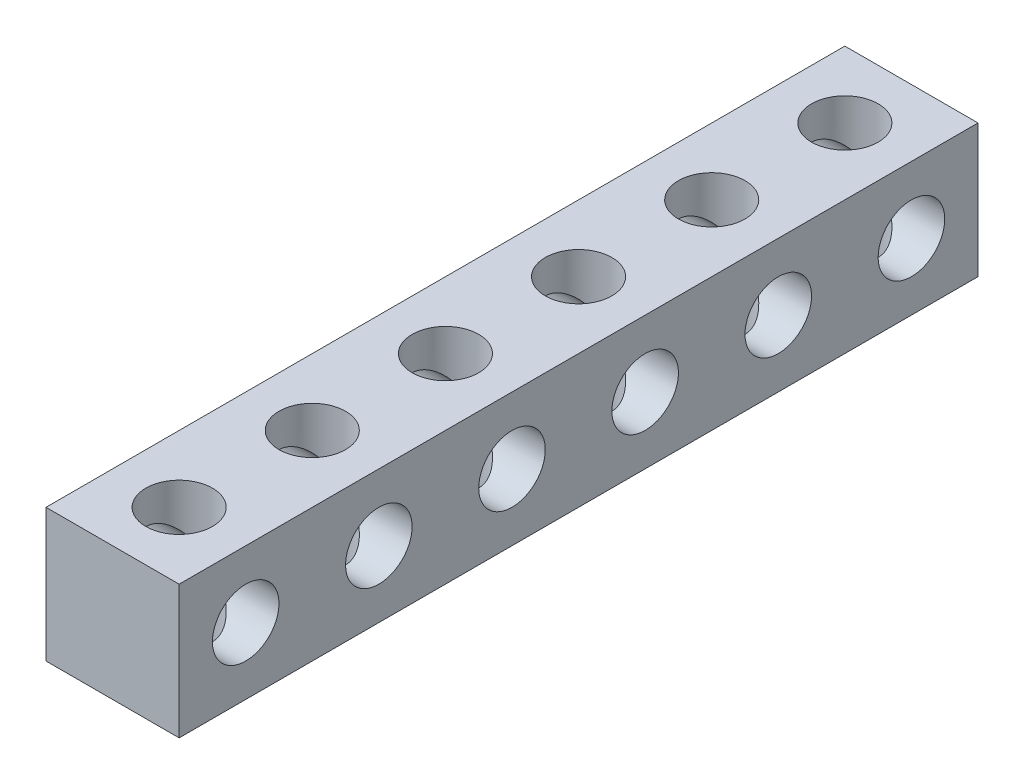
ISO-10303-21;
HEADER;
FILE_DESCRIPTION(('STEP AP214'),'2;1');
FILE_NAME('part.step','',(''),(''),'','','');
FILE_SCHEMA(('AUTOMOTIVE_DESIGN { 1 0 10303 214 1 1 1 1 }'));
ENDSEC;
DATA;
#1=APPLICATION_CONTEXT('core data for automotive mechanical design processes');
#2=APPLICATION_PROTOCOL_DEFINITION('international standard','automotive_design',2000,#1);
#3=PRODUCT_CONTEXT('',#1,'mechanical');
#4=PRODUCT('Part','Part','',(#3));
#5=PRODUCT_RELATED_PRODUCT_CATEGORY('part','',(#4));
#6=PRODUCT_DEFINITION_FORMATION('','',#4);
#7=PRODUCT_DEFINITION_CONTEXT('part definition',#1,'design');
#8=PRODUCT_DEFINITION('design','',#6,#7);
#9=PRODUCT_DEFINITION_SHAPE('','',#8);
#10=(LENGTH_UNIT() NAMED_UNIT(*) SI_UNIT(.MILLI.,.METRE.));
#11=(NAMED_UNIT(*) PLANE_ANGLE_UNIT() SI_UNIT($,.RADIAN.));
#12=(NAMED_UNIT(*) SI_UNIT($,.STERADIAN.) SOLID_ANGLE_UNIT());
#13=UNCERTAINTY_MEASURE_WITH_UNIT(LENGTH_MEASURE(1.E-05),#10,'distance_accuracy_value','');
#14=(GEOMETRIC_REPRESENTATION_CONTEXT(3) GLOBAL_UNCERTAINTY_ASSIGNED_CONTEXT((#13)) GLOBAL_UNIT_ASSIGNED_CONTEXT((#10,
#11,#12)) REPRESENTATION_CONTEXT('',''));
#15=CARTESIAN_POINT('',(0.,0.,0.));
#16=DIRECTION('',(0.,0.,1.));
#17=DIRECTION('',(1.,0.,0.));
#18=AXIS2_PLACEMENT_3D('',#15,#16,#17);
#19=CARTESIAN_POINT('',(0.,-6.35,-31.75));
#20=DIRECTION('',(0.,1.,0.));
#21=DIRECTION('',(0.,0.,1.));
#22=AXIS2_PLACEMENT_3D('',#19,#20,#21);
#23=CYLINDRICAL_SURFACE('',#22,3.175);
#24=CARTESIAN_POINT('',(0.,6.35,-31.75));
#25=DIRECTION('',(0.,1.,0.));
#26=DIRECTION('',(0.,0.,1.));
#27=AXIS2_PLACEMENT_3D('',#24,#25,#26);
#28=CIRCLE('',#27,3.175);
#29=CARTESIAN_POINT('',(0.,6.35,-28.575));
#30=VERTEX_POINT('',#29);
#31=EDGE_CURVE('E244',#30,#30,#28,.T.);
#32=ORIENTED_EDGE('',*,*,#31,.T.);
#33=EDGE_LOOP('',(#32));
#34=FACE_BOUND('',#33,.T.);
#35=CARTESIAN_POINT('',(0.,-4.43319989072576E-13,-31.75));
#36=DIRECTION('',(0.707106781186547,0.707106781186547,0.));
#37=DIRECTION('',(-0.707106781186547,0.707106781186547,0.));
#38=AXIS2_PLACEMENT_3D('',#35,#36,#37);
#39=ELLIPSE('',#38,4.49012806053457,3.175);
#40=CARTESIAN_POINT('',(0.,-4.43319989072576E-13,-28.575));
#41=VERTEX_POINT('',#40);
#42=CARTESIAN_POINT('',(0.,-4.43319989072576E-13,-34.925));
#43=VERTEX_POINT('',#42);
#44=EDGE_CURVE('E46',#41,#43,#39,.F.);
#45=ORIENTED_EDGE('',*,*,#44,.T.);
#46=CARTESIAN_POINT('',(0.,-4.43319989072576E-13,-31.75));
#47=DIRECTION('',(-0.707106781186547,0.707106781186547,0.));
#48=DIRECTION('',(0.707106781186547,0.707106781186547,0.));
#49=AXIS2_PLACEMENT_3D('',#46,#47,#48);
#50=ELLIPSE('',#49,4.49012806053457,3.175);
#51=EDGE_CURVE('E11',#43,#41,#50,.F.);
#52=ORIENTED_EDGE('',*,*,#51,.T.);
#53=EDGE_LOOP('',(#45,#52));
#54=FACE_BOUND('',#53,.T.);
#55=ADVANCED_FACE('F33',(#34,#54),#23,.F.);
#56=CARTESIAN_POINT('',(5.32101756039693E-13,-6.35,19.05));
#57=DIRECTION('',(0.,1.,0.));
#58=DIRECTION('',(0.,0.,1.));
#59=AXIS2_PLACEMENT_3D('',#56,#57,#58);
#60=CYLINDRICAL_SURFACE('',#59,3.175);
#61=CARTESIAN_POINT('',(5.32101756039693E-13,6.35,19.05));
#62=DIRECTION('',(0.,1.,0.));
#63=DIRECTION('',(0.,0.,1.));
#64=AXIS2_PLACEMENT_3D('',#61,#62,#63);
#65=CIRCLE('',#64,3.175);
#66=CARTESIAN_POINT('',(5.32101756039693E-13,6.35,22.225));
#67=VERTEX_POINT('',#66);
#68=EDGE_CURVE('E237',#67,#67,#65,.T.);
#69=ORIENTED_EDGE('',*,*,#68,.T.);
#70=EDGE_LOOP('',(#69));
#71=FACE_BOUND('',#70,.T.);
#72=CARTESIAN_POINT('',(5.31897250713293E-13,0.,19.05));
#73=DIRECTION('',(0.707106781186547,0.707106781186547,0.));
#74=DIRECTION('',(-0.707106781186547,0.707106781186547,0.));
#75=AXIS2_PLACEMENT_3D('',#72,#73,#74);
#76=ELLIPSE('',#75,4.49012806053457,3.175);
#77=CARTESIAN_POINT('',(5.31897250713293E-13,0.,22.225));
#78=VERTEX_POINT('',#77);
#79=CARTESIAN_POINT('',(5.31897250713293E-13,0.,15.875));
#80=VERTEX_POINT('',#79);
#81=EDGE_CURVE('E53',#78,#80,#76,.F.);
#82=ORIENTED_EDGE('',*,*,#81,.T.);
#83=CARTESIAN_POINT('',(5.31897250713293E-13,0.,19.05));
#84=DIRECTION('',(-0.707106781186547,0.707106781186547,0.));
#85=DIRECTION('',(0.707106781186547,0.707106781186547,0.));
#86=AXIS2_PLACEMENT_3D('',#83,#84,#85);
#87=ELLIPSE('',#86,4.49012806053457,3.175);
#88=EDGE_CURVE('E162',#80,#78,#87,.F.);
#89=ORIENTED_EDGE('',*,*,#88,.T.);
#90=EDGE_LOOP('',(#82,#89));
#91=FACE_BOUND('',#90,.T.);
#92=ADVANCED_FACE('F177',(#71,#91),#60,.F.);
#93=CARTESIAN_POINT('',(3.9907631702977E-13,-6.35,6.34999999999999));
#94=DIRECTION('',(0.,1.,0.));
#95=DIRECTION('',(0.,0.,1.));
#96=AXIS2_PLACEMENT_3D('',#93,#94,#95);
#97=CYLINDRICAL_SURFACE('',#96,3.175);
#98=CARTESIAN_POINT('',(3.9907631702977E-13,6.35,6.34999999999999));
#99=DIRECTION('',(0.,1.,0.));
#100=DIRECTION('',(0.,0.,1.));
#101=AXIS2_PLACEMENT_3D('',#98,#99,#100);
#102=CIRCLE('',#101,3.175);
#103=CARTESIAN_POINT('',(3.9907631702977E-13,6.35,9.52499999999999));
#104=VERTEX_POINT('',#103);
#105=EDGE_CURVE('E233',#104,#104,#102,.T.);
#106=ORIENTED_EDGE('',*,*,#105,.T.);
#107=EDGE_LOOP('',(#106));
#108=FACE_BOUND('',#107,.T.);
#109=CARTESIAN_POINT('',(3.99031358252218E-13,-1.77154523281433E-13,6.35));
#110=DIRECTION('',(0.707106781186547,0.707106781186547,0.));
#111=DIRECTION('',(-0.707106781186547,0.707106781186547,0.));
#112=AXIS2_PLACEMENT_3D('',#109,#110,#111);
#113=ELLIPSE('',#112,4.49012806053457,3.175);
#114=CARTESIAN_POINT('',(3.99031358252218E-13,-1.77154523281433E-13,9.525));
#115=VERTEX_POINT('',#114);
#116=CARTESIAN_POINT('',(3.99031358252218E-13,-1.77154523281433E-13,3.175));
#117=VERTEX_POINT('',#116);
#118=EDGE_CURVE('E144',#115,#117,#113,.F.);
#119=ORIENTED_EDGE('',*,*,#118,.T.);
#120=CARTESIAN_POINT('',(3.99031358252218E-13,-1.77154523281433E-13,6.35));
#121=DIRECTION('',(-0.707106781186547,0.707106781186547,0.));
#122=DIRECTION('',(0.707106781186547,0.707106781186547,0.));
#123=AXIS2_PLACEMENT_3D('',#120,#121,#122);
#124=ELLIPSE('',#123,4.49012806053457,3.175);
#125=EDGE_CURVE('E152',#117,#115,#124,.F.);
#126=ORIENTED_EDGE('',*,*,#125,.T.);
#127=EDGE_LOOP('',(#119,#126));
#128=FACE_BOUND('',#127,.T.);
#129=ADVANCED_FACE('F183',(#108,#128),#97,.F.);
#130=CARTESIAN_POINT('',(2.66050878019847E-13,-6.35,-6.35));
#131=DIRECTION('',(0.,1.,0.));
#132=DIRECTION('',(0.,0.,1.));
#133=AXIS2_PLACEMENT_3D('',#130,#131,#132);
#134=CYLINDRICAL_SURFACE('',#133,3.175);
#135=CARTESIAN_POINT('',(2.66050878019847E-13,6.35,-6.35));
#136=DIRECTION('',(0.,1.,0.));
#137=DIRECTION('',(0.,0.,1.));
#138=AXIS2_PLACEMENT_3D('',#135,#136,#137);
#139=CIRCLE('',#138,3.175);
#140=CARTESIAN_POINT('',(2.66050878019847E-13,6.35,-3.175));
#141=VERTEX_POINT('',#140);
#142=EDGE_CURVE('E229',#141,#141,#139,.T.);
#143=ORIENTED_EDGE('',*,*,#142,.T.);
#144=EDGE_LOOP('',(#143));
#145=FACE_BOUND('',#144,.T.);
#146=CARTESIAN_POINT('',(2.66165465791143E-13,-2.66165465791143E-13,-6.35));
#147=DIRECTION('',(0.707106781186547,0.707106781186547,0.));
#148=DIRECTION('',(-0.707106781186547,0.707106781186547,0.));
#149=AXIS2_PLACEMENT_3D('',#146,#147,#148);
#150=ELLIPSE('',#149,4.49012806053457,3.175);
#151=CARTESIAN_POINT('',(2.66165465791143E-13,-2.66165465791143E-13,-3.175));
#152=VERTEX_POINT('',#151);
#153=CARTESIAN_POINT('',(2.66165465791143E-13,-2.66165465791143E-13,-9.525));
#154=VERTEX_POINT('',#153);
#155=EDGE_CURVE('E128',#152,#154,#150,.F.);
#156=ORIENTED_EDGE('',*,*,#155,.T.);
#157=CARTESIAN_POINT('',(2.66165465791143E-13,-2.66165465791143E-13,-6.35));
#158=DIRECTION('',(-0.707106781186547,0.707106781186547,0.));
#159=DIRECTION('',(0.707106781186547,0.707106781186547,0.));
#160=AXIS2_PLACEMENT_3D('',#157,#158,#159);
#161=ELLIPSE('',#160,4.49012806053457,3.175);
#162=EDGE_CURVE('E141',#154,#152,#161,.F.);
#163=ORIENTED_EDGE('',*,*,#162,.T.);
#164=EDGE_LOOP('',(#156,#163));
#165=FACE_BOUND('',#164,.T.);
#166=ADVANCED_FACE('F313',(#145,#165),#134,.F.);
#167=CARTESIAN_POINT('',(1.33025439009923E-13,-6.35,-19.05));
#168=DIRECTION('',(0.,1.,0.));
#169=DIRECTION('',(0.,0.,1.));
#170=AXIS2_PLACEMENT_3D('',#167,#168,#169);
#171=CYLINDRICAL_SURFACE('',#170,3.175);
#172=CARTESIAN_POINT('',(1.33025439009923E-13,6.35,-19.05));
#173=DIRECTION('',(0.,1.,0.));
#174=DIRECTION('',(0.,0.,1.));
#175=AXIS2_PLACEMENT_3D('',#172,#173,#174);
#176=CIRCLE('',#175,3.175);
#177=CARTESIAN_POINT('',(1.33025439009923E-13,6.35,-15.875));
#178=VERTEX_POINT('',#177);
#179=EDGE_CURVE('E225',#178,#178,#176,.T.);
#180=ORIENTED_EDGE('',*,*,#179,.T.);
#181=EDGE_LOOP('',(#180));
#182=FACE_BOUND('',#181,.T.);
#183=CARTESIAN_POINT('',(1.32865892461075E-13,-3.5474272743186E-13,-19.05));
#184=DIRECTION('',(0.707106781186547,0.707106781186547,0.));
#185=DIRECTION('',(-0.707106781186547,0.707106781186547,0.));
#186=AXIS2_PLACEMENT_3D('',#183,#184,#185);
#187=ELLIPSE('',#186,4.49012806053457,3.175);
#188=CARTESIAN_POINT('',(1.32865892461075E-13,-3.5474272743186E-13,-15.875));
#189=VERTEX_POINT('',#188);
#190=CARTESIAN_POINT('',(1.32865892461075E-13,-3.5474272743186E-13,-22.225));
#191=VERTEX_POINT('',#190);
#192=EDGE_CURVE('E119',#189,#191,#187,.F.);
#193=ORIENTED_EDGE('',*,*,#192,.T.);
#194=CARTESIAN_POINT('',(1.32865892461075E-13,-3.5474272743186E-13,-19.05));
#195=DIRECTION('',(-0.707106781186547,0.707106781186547,0.));
#196=DIRECTION('',(0.707106781186547,0.707106781186547,0.));
#197=AXIS2_PLACEMENT_3D('',#194,#195,#196);
#198=ELLIPSE('',#197,4.49012806053457,3.175);
#199=EDGE_CURVE('E115',#191,#189,#198,.F.);
#200=ORIENTED_EDGE('',*,*,#199,.T.);
#201=EDGE_LOOP('',(#193,#200));
#202=FACE_BOUND('',#201,.T.);
#203=ADVANCED_FACE('F127',(#182,#202),#171,.F.);
#204=CARTESIAN_POINT('',(6.65127195049617E-13,-6.35,31.75));
#205=DIRECTION('',(0.,1.,0.));
#206=DIRECTION('',(0.,0.,1.));
#207=AXIS2_PLACEMENT_3D('',#204,#205,#206);
#208=CYLINDRICAL_SURFACE('',#207,3.175);
#209=CARTESIAN_POINT('',(6.65127195049617E-13,6.35,31.75));
#210=DIRECTION('',(0.,1.,0.));
#211=DIRECTION('',(0.,0.,1.));
#212=AXIS2_PLACEMENT_3D('',#209,#210,#211);
#213=CIRCLE('',#212,3.175);
#214=CARTESIAN_POINT('',(6.65127195049617E-13,6.35,34.925));
#215=VERTEX_POINT('',#214);
#216=EDGE_CURVE('E241',#215,#215,#213,.T.);
#217=ORIENTED_EDGE('',*,*,#216,.T.);
#218=EDGE_LOOP('',(#217));
#219=FACE_BOUND('',#218,.T.);
#220=CARTESIAN_POINT('',(6.65196824043361E-13,0.,31.75));
#221=DIRECTION('',(0.707106781186547,0.707106781186547,0.));
#222=DIRECTION('',(-0.707106781186547,0.707106781186547,0.));
#223=AXIS2_PLACEMENT_3D('',#220,#221,#222);
#224=ELLIPSE('',#223,4.49012806053457,3.175);
#225=CARTESIAN_POINT('',(6.65196824043361E-13,0.,34.925));
#226=VERTEX_POINT('',#225);
#227=CARTESIAN_POINT('',(6.65196824043361E-13,0.,28.575));
#228=VERTEX_POINT('',#227);
#229=EDGE_CURVE('E277',#226,#228,#224,.F.);
#230=ORIENTED_EDGE('',*,*,#229,.T.);
#231=CARTESIAN_POINT('',(6.65196824043361E-13,0.,31.75));
#232=DIRECTION('',(-0.707106781186547,0.707106781186547,0.));
#233=DIRECTION('',(0.707106781186547,0.707106781186547,0.));
#234=AXIS2_PLACEMENT_3D('',#231,#232,#233);
#235=ELLIPSE('',#234,4.49012806053457,3.175);
#236=EDGE_CURVE('E125',#228,#226,#235,.F.);
#237=ORIENTED_EDGE('',*,*,#236,.T.);
#238=EDGE_LOOP('',(#230,#237));
#239=FACE_BOUND('',#238,.T.);
#240=ADVANCED_FACE('F198',(#219,#239),#208,.F.);
#241=CARTESIAN_POINT('',(6.35,-6.35,38.1));
#242=DIRECTION('',(-1.,0.,0.));
#243=DIRECTION('',(0.,0.,1.));
#244=AXIS2_PLACEMENT_3D('',#241,#242,#243);
#245=PLANE('',#244);
#246=CARTESIAN_POINT('',(6.35,0.,19.05));
#247=DIRECTION('',(-1.,0.,0.));
#248=DIRECTION('',(0.,0.,1.));
#249=AXIS2_PLACEMENT_3D('',#246,#247,#248);
#250=CIRCLE('',#249,3.175);
#251=CARTESIAN_POINT('',(6.35,0.,22.225));
#252=VERTEX_POINT('',#251);
#253=EDGE_CURVE('E425',#252,#252,#250,.T.);
#254=ORIENTED_EDGE('',*,*,#253,.T.);
#255=EDGE_LOOP('',(#254));
#256=FACE_BOUND('',#255,.T.);
#257=CARTESIAN_POINT('',(6.35,-1.77367252013231E-13,6.35));
#258=DIRECTION('',(-1.,0.,0.));
#259=DIRECTION('',(0.,0.,1.));
#260=AXIS2_PLACEMENT_3D('',#257,#258,#259);
#261=CIRCLE('',#260,3.175);
#262=CARTESIAN_POINT('',(6.35,-1.77367252013231E-13,9.525));
#263=VERTEX_POINT('',#262);
#264=EDGE_CURVE('E432',#263,#263,#261,.T.);
#265=ORIENTED_EDGE('',*,*,#264,.T.);
#266=EDGE_LOOP('',(#265));
#267=FACE_BOUND('',#266,.T.);
#268=CARTESIAN_POINT('',(6.35,-2.66050878019847E-13,-6.34999999999999));
#269=DIRECTION('',(-1.,0.,0.));
#270=DIRECTION('',(0.,0.,1.));
#271=AXIS2_PLACEMENT_3D('',#268,#269,#270);
#272=CIRCLE('',#271,3.175);
#273=CARTESIAN_POINT('',(6.35,-2.66050878019847E-13,-3.175));
#274=VERTEX_POINT('',#273);
#275=EDGE_CURVE('E411',#274,#274,#272,.T.);
#276=ORIENTED_EDGE('',*,*,#275,.T.);
#277=EDGE_LOOP('',(#276));
#278=FACE_BOUND('',#277,.T.);
#279=CARTESIAN_POINT('',(6.35,-3.54734504026462E-13,-19.05));
#280=DIRECTION('',(-1.,0.,0.));
#281=DIRECTION('',(0.,0.,1.));
#282=AXIS2_PLACEMENT_3D('',#279,#280,#281);
#283=CIRCLE('',#282,3.175);
#284=CARTESIAN_POINT('',(6.35,-3.54734504026462E-13,-15.875));
#285=VERTEX_POINT('',#284);
#286=EDGE_CURVE('E405',#285,#285,#283,.T.);
#287=ORIENTED_EDGE('',*,*,#286,.T.);
#288=EDGE_LOOP('',(#287));
#289=FACE_BOUND('',#288,.T.);
#290=CARTESIAN_POINT('',(6.35,-4.43418130033078E-13,-31.75));
#291=DIRECTION('',(-1.,0.,0.));
#292=DIRECTION('',(0.,0.,1.));
#293=AXIS2_PLACEMENT_3D('',#290,#291,#292);
#294=CIRCLE('',#293,3.175);
#295=CARTESIAN_POINT('',(6.35,-4.43418130033078E-13,-28.575));
#296=VERTEX_POINT('',#295);
#297=EDGE_CURVE('E414',#296,#296,#294,.T.);
#298=ORIENTED_EDGE('',*,*,#297,.T.);
#299=EDGE_LOOP('',(#298));
#300=FACE_BOUND('',#299,.T.);
#301=CARTESIAN_POINT('',(6.35,0.,31.75));
#302=DIRECTION('',(-1.,0.,0.));
#303=DIRECTION('',(0.,0.,1.));
#304=AXIS2_PLACEMENT_3D('',#301,#302,#303);
#305=CIRCLE('',#304,3.175);
#306=CARTESIAN_POINT('',(6.35,0.,34.925));
#307=VERTEX_POINT('',#306);
#308=EDGE_CURVE('E335',#307,#307,#305,.T.);
#309=ORIENTED_EDGE('',*,*,#308,.T.);
#310=EDGE_LOOP('',(#309));
#311=FACE_BOUND('',#310,.T.);
#312=DIRECTION('',(0.,1.,0.));
#313=VECTOR('',#312,1.);
#314=CARTESIAN_POINT('',(6.35,-6.35,-38.1));
#315=LINE('',#314,#313);
#316=CARTESIAN_POINT('',(6.35,-6.35,-38.1));
#317=VERTEX_POINT('',#316);
#318=CARTESIAN_POINT('',(6.35,6.35,-38.1));
#319=VERTEX_POINT('',#318);
#320=EDGE_CURVE('E256',#317,#319,#315,.T.);
#321=ORIENTED_EDGE('',*,*,#320,.T.);
#322=DIRECTION('',(0.,0.,-1.));
#323=VECTOR('',#322,1.);
#324=CARTESIAN_POINT('',(6.35,6.35,38.1));
#325=LINE('',#324,#323);
#326=CARTESIAN_POINT('',(6.35,6.35,38.1));
#327=VERTEX_POINT('',#326);
#328=EDGE_CURVE('E252',#327,#319,#325,.T.);
#329=ORIENTED_EDGE('',*,*,#328,.F.);
#330=DIRECTION('',(0.,1.,0.));
#331=VECTOR('',#330,1.);
#332=CARTESIAN_POINT('',(6.35,-6.35,38.1));
#333=LINE('',#332,#331);
#334=CARTESIAN_POINT('',(6.35,-6.35,38.1));
#335=VERTEX_POINT('',#334);
#336=EDGE_CURVE('E267',#335,#327,#333,.T.);
#337=ORIENTED_EDGE('',*,*,#336,.F.);
#338=DIRECTION('',(0.,0.,-1.));
#339=VECTOR('',#338,1.);
#340=CARTESIAN_POINT('',(6.35,-6.35,38.1));
#341=LINE('',#340,#339);
#342=EDGE_CURVE('E271',#335,#317,#341,.T.);
#343=ORIENTED_EDGE('',*,*,#342,.T.);
#344=EDGE_LOOP('',(#321,#329,#337,#343));
#345=FACE_BOUND('',#344,.T.);
#346=ADVANCED_FACE('F35',(#256,#267,#278,#289,#300,#311,#345),#245,.F.);
#347=CARTESIAN_POINT('',(-6.35,6.35,38.1));
#348=DIRECTION('',(0.,-1.,0.));
#349=DIRECTION('',(0.,0.,-1.));
#350=AXIS2_PLACEMENT_3D('',#347,#348,#349);
#351=PLANE('',#350);
#352=ORIENTED_EDGE('',*,*,#179,.F.);
#353=EDGE_LOOP('',(#352));
#354=FACE_BOUND('',#353,.T.);
#355=ORIENTED_EDGE('',*,*,#142,.F.);
#356=EDGE_LOOP('',(#355));
#357=FACE_BOUND('',#356,.T.);
#358=ORIENTED_EDGE('',*,*,#105,.F.);
#359=EDGE_LOOP('',(#358));
#360=FACE_BOUND('',#359,.T.);
#361=ORIENTED_EDGE('',*,*,#68,.F.);
#362=EDGE_LOOP('',(#361));
#363=FACE_BOUND('',#362,.T.);
#364=ORIENTED_EDGE('',*,*,#216,.F.);
#365=EDGE_LOOP('',(#364));
#366=FACE_BOUND('',#365,.T.);
#367=ORIENTED_EDGE('',*,*,#31,.F.);
#368=EDGE_LOOP('',(#367));
#369=FACE_BOUND('',#368,.T.);
#370=DIRECTION('',(-1.,0.,0.));
#371=VECTOR('',#370,1.);
#372=CARTESIAN_POINT('',(-6.35,6.35,-38.1));
#373=LINE('',#372,#371);
#374=CARTESIAN_POINT('',(-6.35,6.35,-38.1));
#375=VERTEX_POINT('',#374);
#376=EDGE_CURVE('E247',#319,#375,#373,.T.);
#377=ORIENTED_EDGE('',*,*,#376,.T.);
#378=DIRECTION('',(0.,0.,-1.));
#379=VECTOR('',#378,1.);
#380=CARTESIAN_POINT('',(-6.35,6.35,38.1));
#381=LINE('',#380,#379);
#382=CARTESIAN_POINT('',(-6.35,6.35,38.1));
#383=VERTEX_POINT('',#382);
#384=EDGE_CURVE('E249',#383,#375,#381,.T.);
#385=ORIENTED_EDGE('',*,*,#384,.F.);
#386=DIRECTION('',(-1.,0.,0.));
#387=VECTOR('',#386,1.);
#388=CARTESIAN_POINT('',(-6.35,6.35,38.1));
#389=LINE('',#388,#387);
#390=EDGE_CURVE('E343',#327,#383,#389,.T.);
#391=ORIENTED_EDGE('',*,*,#390,.F.);
#392=ORIENTED_EDGE('',*,*,#328,.T.);
#393=EDGE_LOOP('',(#377,#385,#391,#392));
#394=FACE_BOUND('',#393,.T.);
#395=ADVANCED_FACE('F214',(#354,#357,#360,#363,#366,#369,#394),#351,.F.);
#396=CARTESIAN_POINT('',(-6.35,-6.35,38.1));
#397=DIRECTION('',(1.,0.,0.));
#398=DIRECTION('',(0.,0.,-1.));
#399=AXIS2_PLACEMENT_3D('',#396,#397,#398);
#400=PLANE('',#399);
#401=CARTESIAN_POINT('',(-6.35,0.,19.05));
#402=DIRECTION('',(-1.,0.,0.));
#403=DIRECTION('',(0.,0.,1.));
#404=AXIS2_PLACEMENT_3D('',#401,#402,#403);
#405=CIRCLE('',#404,3.175);
#406=CARTESIAN_POINT('',(-6.35,0.,22.225));
#407=VERTEX_POINT('',#406);
#408=EDGE_CURVE('E428',#407,#407,#405,.T.);
#409=ORIENTED_EDGE('',*,*,#408,.F.);
#410=EDGE_LOOP('',(#409));
#411=FACE_BOUND('',#410,.T.);
#412=CARTESIAN_POINT('',(-6.35,-1.77367252013231E-13,6.35));
#413=DIRECTION('',(-1.,0.,0.));
#414=DIRECTION('',(0.,0.,1.));
#415=AXIS2_PLACEMENT_3D('',#412,#413,#414);
#416=CIRCLE('',#415,3.175);
#417=CARTESIAN_POINT('',(-6.35,-1.77367252013231E-13,9.525));
#418=VERTEX_POINT('',#417);
#419=EDGE_CURVE('E437',#418,#418,#416,.T.);
#420=ORIENTED_EDGE('',*,*,#419,.F.);
#421=EDGE_LOOP('',(#420));
#422=FACE_BOUND('',#421,.T.);
#423=CARTESIAN_POINT('',(-6.35,-2.66050878019847E-13,-6.34999999999999));
#424=DIRECTION('',(-1.,0.,0.));
#425=DIRECTION('',(0.,0.,1.));
#426=AXIS2_PLACEMENT_3D('',#423,#424,#425);
#427=CIRCLE('',#426,3.175);
#428=CARTESIAN_POINT('',(-6.35,-2.66050878019847E-13,-3.175));
#429=VERTEX_POINT('',#428);
#430=EDGE_CURVE('E407',#429,#429,#427,.T.);
#431=ORIENTED_EDGE('',*,*,#430,.F.);
#432=EDGE_LOOP('',(#431));
#433=FACE_BOUND('',#432,.T.);
#434=CARTESIAN_POINT('',(-6.35,-3.54734504026462E-13,-19.05));
#435=DIRECTION('',(-1.,0.,0.));
#436=DIRECTION('',(0.,0.,1.));
#437=AXIS2_PLACEMENT_3D('',#434,#435,#436);
#438=CIRCLE('',#437,3.175);
#439=CARTESIAN_POINT('',(-6.35,-3.54734504026462E-13,-15.875));
#440=VERTEX_POINT('',#439);
#441=EDGE_CURVE('E408',#440,#440,#438,.T.);
#442=ORIENTED_EDGE('',*,*,#441,.F.);
#443=EDGE_LOOP('',(#442));
#444=FACE_BOUND('',#443,.T.);
#445=CARTESIAN_POINT('',(-6.35,-4.43418130033078E-13,-31.75));
#446=DIRECTION('',(-1.,0.,0.));
#447=DIRECTION('',(0.,0.,1.));
#448=AXIS2_PLACEMENT_3D('',#445,#446,#447);
#449=CIRCLE('',#448,3.175);
#450=CARTESIAN_POINT('',(-6.35,-4.43418130033078E-13,-28.575));
#451=VERTEX_POINT('',#450);
#452=EDGE_CURVE('E420',#451,#451,#449,.T.);
#453=ORIENTED_EDGE('',*,*,#452,.F.);
#454=EDGE_LOOP('',(#453));
#455=FACE_BOUND('',#454,.T.);
#456=CARTESIAN_POINT('',(-6.35,0.,31.75));
#457=DIRECTION('',(-1.,0.,0.));
#458=DIRECTION('',(0.,0.,1.));
#459=AXIS2_PLACEMENT_3D('',#456,#457,#458);
#460=CIRCLE('',#459,3.175);
#461=CARTESIAN_POINT('',(-6.35,0.,34.925));
#462=VERTEX_POINT('',#461);
#463=EDGE_CURVE('E357',#462,#462,#460,.T.);
#464=ORIENTED_EDGE('',*,*,#463,.F.);
#465=EDGE_LOOP('',(#464));
#466=FACE_BOUND('',#465,.T.);
#467=DIRECTION('',(0.,-1.,0.));
#468=VECTOR('',#467,1.);
#469=CARTESIAN_POINT('',(-6.35,-6.35,-38.1));
#470=LINE('',#469,#468);
#471=CARTESIAN_POINT('',(-6.35,-6.35,-38.1));
#472=VERTEX_POINT('',#471);
#473=EDGE_CURVE('E255',#375,#472,#470,.T.);
#474=ORIENTED_EDGE('',*,*,#473,.T.);
#475=DIRECTION('',(0.,0.,-1.));
#476=VECTOR('',#475,1.);
#477=CARTESIAN_POINT('',(-6.35,-6.35,38.1));
#478=LINE('',#477,#476);
#479=CARTESIAN_POINT('',(-6.35,-6.35,38.1));
#480=VERTEX_POINT('',#479);
#481=EDGE_CURVE('E262',#480,#472,#478,.T.);
#482=ORIENTED_EDGE('',*,*,#481,.F.);
#483=DIRECTION('',(0.,-1.,0.));
#484=VECTOR('',#483,1.);
#485=CARTESIAN_POINT('',(-6.35,-6.35,38.1));
#486=LINE('',#485,#484);
#487=EDGE_CURVE('E261',#383,#480,#486,.T.);
#488=ORIENTED_EDGE('',*,*,#487,.F.);
#489=ORIENTED_EDGE('',*,*,#384,.T.);
#490=EDGE_LOOP('',(#474,#482,#488,#489));
#491=FACE_BOUND('',#490,.T.);
#492=ADVANCED_FACE('F211',(#411,#422,#433,#444,#455,#466,#491),#400,.F.);
#493=CARTESIAN_POINT('',(-6.35,-6.35,38.1));
#494=DIRECTION('',(0.,1.,0.));
#495=DIRECTION('',(0.,0.,1.));
#496=AXIS2_PLACEMENT_3D('',#493,#494,#495);
#497=PLANE('',#496);
#498=CARTESIAN_POINT('',(1.33025439009923E-13,-6.35,-19.05));
#499=DIRECTION('',(0.,1.,0.));
#500=DIRECTION('',(0.,0.,1.));
#501=AXIS2_PLACEMENT_3D('',#498,#499,#500);
#502=CIRCLE('',#501,3.175);
#503=CARTESIAN_POINT('',(1.33025439009923E-13,-6.35,-15.875));
#504=VERTEX_POINT('',#503);
#505=EDGE_CURVE('E340',#504,#504,#502,.T.);
#506=ORIENTED_EDGE('',*,*,#505,.T.);
#507=EDGE_LOOP('',(#506));
#508=FACE_BOUND('',#507,.T.);
#509=CARTESIAN_POINT('',(2.66050878019847E-13,-6.35,-6.35));
#510=DIRECTION('',(0.,1.,0.));
#511=DIRECTION('',(0.,0.,1.));
#512=AXIS2_PLACEMENT_3D('',#509,#510,#511);
#513=CIRCLE('',#512,3.175);
#514=CARTESIAN_POINT('',(2.66050878019847E-13,-6.35,-3.175));
#515=VERTEX_POINT('',#514);
#516=EDGE_CURVE('E354',#515,#515,#513,.T.);
#517=ORIENTED_EDGE('',*,*,#516,.T.);
#518=EDGE_LOOP('',(#517));
#519=FACE_BOUND('',#518,.T.);
#520=CARTESIAN_POINT('',(3.9907631702977E-13,-6.35,6.34999999999999));
#521=DIRECTION('',(0.,1.,0.));
#522=DIRECTION('',(0.,0.,1.));
#523=AXIS2_PLACEMENT_3D('',#520,#521,#522);
#524=CIRCLE('',#523,3.175);
#525=CARTESIAN_POINT('',(3.9907631702977E-13,-6.35,9.52499999999999));
#526=VERTEX_POINT('',#525);
#527=EDGE_CURVE('E326',#526,#526,#524,.T.);
#528=ORIENTED_EDGE('',*,*,#527,.T.);
#529=EDGE_LOOP('',(#528));
#530=FACE_BOUND('',#529,.T.);
#531=CARTESIAN_POINT('',(5.32101756039693E-13,-6.35,19.05));
#532=DIRECTION('',(0.,1.,0.));
#533=DIRECTION('',(0.,0.,1.));
#534=AXIS2_PLACEMENT_3D('',#531,#532,#533);
#535=CIRCLE('',#534,3.175);
#536=CARTESIAN_POINT('',(5.32101756039693E-13,-6.35,22.225));
#537=VERTEX_POINT('',#536);
#538=EDGE_CURVE('E323',#537,#537,#535,.T.);
#539=ORIENTED_EDGE('',*,*,#538,.T.);
#540=EDGE_LOOP('',(#539));
#541=FACE_BOUND('',#540,.T.);
#542=CARTESIAN_POINT('',(6.65127195049617E-13,-6.35,31.75));
#543=DIRECTION('',(0.,1.,0.));
#544=DIRECTION('',(0.,0.,1.));
#545=AXIS2_PLACEMENT_3D('',#542,#543,#544);
#546=CIRCLE('',#545,3.175);
#547=CARTESIAN_POINT('',(6.65127195049617E-13,-6.35,34.925));
#548=VERTEX_POINT('',#547);
#549=EDGE_CURVE('E328',#548,#548,#546,.T.);
#550=ORIENTED_EDGE('',*,*,#549,.T.);
#551=EDGE_LOOP('',(#550));
#552=FACE_BOUND('',#551,.T.);
#553=CARTESIAN_POINT('',(0.,-6.35,-31.75));
#554=DIRECTION('',(0.,1.,0.));
#555=DIRECTION('',(0.,0.,1.));
#556=AXIS2_PLACEMENT_3D('',#553,#554,#555);
#557=CIRCLE('',#556,3.175);
#558=CARTESIAN_POINT('',(0.,-6.35,-28.575));
#559=VERTEX_POINT('',#558);
#560=EDGE_CURVE('E336',#559,#559,#557,.T.);
#561=ORIENTED_EDGE('',*,*,#560,.T.);
#562=EDGE_LOOP('',(#561));
#563=FACE_BOUND('',#562,.T.);
#564=DIRECTION('',(1.,0.,0.));
#565=VECTOR('',#564,1.);
#566=CARTESIAN_POINT('',(-6.35,-6.35,-38.1));
#567=LINE('',#566,#565);
#568=EDGE_CURVE('E265',#472,#317,#567,.T.);
#569=ORIENTED_EDGE('',*,*,#568,.T.);
#570=ORIENTED_EDGE('',*,*,#342,.F.);
#571=DIRECTION('',(1.,0.,0.));
#572=VECTOR('',#571,1.);
#573=CARTESIAN_POINT('',(-6.35,-6.35,38.1));
#574=LINE('',#573,#572);
#575=EDGE_CURVE('E274',#480,#335,#574,.T.);
#576=ORIENTED_EDGE('',*,*,#575,.F.);
#577=ORIENTED_EDGE('',*,*,#481,.T.);
#578=EDGE_LOOP('',(#569,#570,#576,#577));
#579=FACE_BOUND('',#578,.T.);
#580=ADVANCED_FACE('F205',(#508,#519,#530,#541,#552,#563,#579),#497,.F.);
#581=CARTESIAN_POINT('',(0.,0.,38.1));
#582=DIRECTION('',(0.,0.,-1.));
#583=DIRECTION('',(-1.,0.,0.));
#584=AXIS2_PLACEMENT_3D('',#581,#582,#583);
#585=PLANE('',#584);
#586=ORIENTED_EDGE('',*,*,#336,.T.);
#587=ORIENTED_EDGE('',*,*,#390,.T.);
#588=ORIENTED_EDGE('',*,*,#487,.T.);
#589=ORIENTED_EDGE('',*,*,#575,.T.);
#590=EDGE_LOOP('',(#586,#587,#588,#589));
#591=FACE_BOUND('',#590,.T.);
#592=ADVANCED_FACE('F199',(#591),#585,.F.);
#593=CARTESIAN_POINT('',(0.,0.,-38.1));
#594=DIRECTION('',(0.,0.,-1.));
#595=DIRECTION('',(-1.,0.,0.));
#596=AXIS2_PLACEMENT_3D('',#593,#594,#595);
#597=PLANE('',#596);
#598=ORIENTED_EDGE('',*,*,#320,.F.);
#599=ORIENTED_EDGE('',*,*,#568,.F.);
#600=ORIENTED_EDGE('',*,*,#473,.F.);
#601=ORIENTED_EDGE('',*,*,#376,.F.);
#602=EDGE_LOOP('',(#598,#599,#600,#601));
#603=FACE_BOUND('',#602,.T.);
#604=ADVANCED_FACE('F192',(#603),#597,.T.);
#605=CARTESIAN_POINT('',(0.,-4.43319989072576E-13,-31.75));
#606=DIRECTION('',(0.707106781186547,0.707106781186547,0.));
#607=DIRECTION('',(-0.707106781186547,0.707106781186547,0.));
#608=AXIS2_PLACEMENT_3D('',#605,#606,#607);
#609=ELLIPSE('',#608,4.49012806053457,3.175);
#610=EDGE_CURVE('E165',#41,#43,#609,.T.);
#611=ORIENTED_EDGE('',*,*,#610,.T.);
#612=CARTESIAN_POINT('',(0.,-4.43319989072576E-13,-31.75));
#613=DIRECTION('',(-0.707106781186547,0.707106781186547,0.));
#614=DIRECTION('',(0.707106781186547,0.707106781186547,0.));
#615=AXIS2_PLACEMENT_3D('',#612,#613,#614);
#616=ELLIPSE('',#615,4.49012806053457,3.175);
#617=EDGE_CURVE('E41',#43,#41,#616,.T.);
#618=ORIENTED_EDGE('',*,*,#617,.T.);
#619=EDGE_LOOP('',(#611,#618));
#620=FACE_BOUND('',#619,.T.);
#621=ORIENTED_EDGE('',*,*,#560,.F.);
#622=EDGE_LOOP('',(#621));
#623=FACE_BOUND('',#622,.T.);
#624=ADVANCED_FACE('F169',(#620,#623),#23,.F.);
#625=CARTESIAN_POINT('',(6.65196824043361E-13,0.,31.75));
#626=DIRECTION('',(0.707106781186547,0.707106781186547,0.));
#627=DIRECTION('',(-0.707106781186547,0.707106781186547,0.));
#628=AXIS2_PLACEMENT_3D('',#625,#626,#627);
#629=ELLIPSE('',#628,4.49012806053457,3.175);
#630=EDGE_CURVE('E279',#226,#228,#629,.T.);
#631=ORIENTED_EDGE('',*,*,#630,.T.);
#632=CARTESIAN_POINT('',(6.65196824043361E-13,0.,31.75));
#633=DIRECTION('',(-0.707106781186547,0.707106781186547,0.));
#634=DIRECTION('',(0.707106781186547,0.707106781186547,0.));
#635=AXIS2_PLACEMENT_3D('',#632,#633,#634);
#636=ELLIPSE('',#635,4.49012806053457,3.175);
#637=EDGE_CURVE('E282',#228,#226,#636,.T.);
#638=ORIENTED_EDGE('',*,*,#637,.T.);
#639=EDGE_LOOP('',(#631,#638));
#640=FACE_BOUND('',#639,.T.);
#641=ORIENTED_EDGE('',*,*,#549,.F.);
#642=EDGE_LOOP('',(#641));
#643=FACE_BOUND('',#642,.T.);
#644=ADVANCED_FACE('F191',(#640,#643),#208,.F.);
#645=CARTESIAN_POINT('',(5.31897250713293E-13,0.,19.05));
#646=DIRECTION('',(0.707106781186547,0.707106781186547,0.));
#647=DIRECTION('',(-0.707106781186547,0.707106781186547,0.));
#648=AXIS2_PLACEMENT_3D('',#645,#646,#647);
#649=ELLIPSE('',#648,4.49012806053457,3.175);
#650=EDGE_CURVE('E156',#78,#80,#649,.T.);
#651=ORIENTED_EDGE('',*,*,#650,.T.);
#652=CARTESIAN_POINT('',(5.31897250713293E-13,0.,19.05));
#653=DIRECTION('',(-0.707106781186547,0.707106781186547,0.));
#654=DIRECTION('',(0.707106781186547,0.707106781186547,0.));
#655=AXIS2_PLACEMENT_3D('',#652,#653,#654);
#656=ELLIPSE('',#655,4.49012806053457,3.175);
#657=EDGE_CURVE('E159',#80,#78,#656,.T.);
#658=ORIENTED_EDGE('',*,*,#657,.T.);
#659=EDGE_LOOP('',(#651,#658));
#660=FACE_BOUND('',#659,.T.);
#661=ORIENTED_EDGE('',*,*,#538,.F.);
#662=EDGE_LOOP('',(#661));
#663=FACE_BOUND('',#662,.T.);
#664=ADVANCED_FACE('F186',(#660,#663),#60,.F.);
#665=CARTESIAN_POINT('',(3.99031358252218E-13,-1.77154523281433E-13,6.35));
#666=DIRECTION('',(0.707106781186547,0.707106781186547,0.));
#667=DIRECTION('',(-0.707106781186547,0.707106781186547,0.));
#668=AXIS2_PLACEMENT_3D('',#665,#666,#667);
#669=ELLIPSE('',#668,4.49012806053457,3.175);
#670=EDGE_CURVE('E146',#115,#117,#669,.T.);
#671=ORIENTED_EDGE('',*,*,#670,.T.);
#672=CARTESIAN_POINT('',(3.99031358252218E-13,-1.77154523281433E-13,6.35));
#673=DIRECTION('',(-0.707106781186547,0.707106781186547,0.));
#674=DIRECTION('',(0.707106781186547,0.707106781186547,0.));
#675=AXIS2_PLACEMENT_3D('',#672,#673,#674);
#676=ELLIPSE('',#675,4.49012806053457,3.175);
#677=EDGE_CURVE('E149',#117,#115,#676,.T.);
#678=ORIENTED_EDGE('',*,*,#677,.T.);
#679=EDGE_LOOP('',(#671,#678));
#680=FACE_BOUND('',#679,.T.);
#681=ORIENTED_EDGE('',*,*,#527,.F.);
#682=EDGE_LOOP('',(#681));
#683=FACE_BOUND('',#682,.T.);
#684=ADVANCED_FACE('F311',(#680,#683),#97,.F.);
#685=CARTESIAN_POINT('',(2.66165465791143E-13,-2.66165465791143E-13,-6.35));
#686=DIRECTION('',(0.707106781186547,0.707106781186547,0.));
#687=DIRECTION('',(-0.707106781186547,0.707106781186547,0.));
#688=AXIS2_PLACEMENT_3D('',#685,#686,#687);
#689=ELLIPSE('',#688,4.49012806053457,3.175);
#690=EDGE_CURVE('E135',#152,#154,#689,.T.);
#691=ORIENTED_EDGE('',*,*,#690,.T.);
#692=CARTESIAN_POINT('',(2.66165465791143E-13,-2.66165465791143E-13,-6.35));
#693=DIRECTION('',(-0.707106781186547,0.707106781186547,0.));
#694=DIRECTION('',(0.707106781186547,0.707106781186547,0.));
#695=AXIS2_PLACEMENT_3D('',#692,#693,#694);
#696=ELLIPSE('',#695,4.49012806053457,3.175);
#697=EDGE_CURVE('E138',#154,#152,#696,.T.);
#698=ORIENTED_EDGE('',*,*,#697,.T.);
#699=EDGE_LOOP('',(#691,#698));
#700=FACE_BOUND('',#699,.T.);
#701=ORIENTED_EDGE('',*,*,#516,.F.);
#702=EDGE_LOOP('',(#701));
#703=FACE_BOUND('',#702,.T.);
#704=ADVANCED_FACE('F303',(#700,#703),#134,.F.);
#705=CARTESIAN_POINT('',(1.32865892461075E-13,-3.5474272743186E-13,-19.05));
#706=DIRECTION('',(0.707106781186547,0.707106781186547,0.));
#707=DIRECTION('',(-0.707106781186547,0.707106781186547,0.));
#708=AXIS2_PLACEMENT_3D('',#705,#706,#707);
#709=ELLIPSE('',#708,4.49012806053457,3.175);
#710=EDGE_CURVE('E111',#189,#191,#709,.T.);
#711=ORIENTED_EDGE('',*,*,#710,.T.);
#712=CARTESIAN_POINT('',(1.32865892461075E-13,-3.5474272743186E-13,-19.05));
#713=DIRECTION('',(-0.707106781186547,0.707106781186547,0.));
#714=DIRECTION('',(0.707106781186547,0.707106781186547,0.));
#715=AXIS2_PLACEMENT_3D('',#712,#713,#714);
#716=ELLIPSE('',#715,4.49012806053457,3.175);
#717=EDGE_CURVE('E118',#191,#189,#716,.T.);
#718=ORIENTED_EDGE('',*,*,#717,.T.);
#719=EDGE_LOOP('',(#711,#718));
#720=FACE_BOUND('',#719,.T.);
#721=ORIENTED_EDGE('',*,*,#505,.F.);
#722=EDGE_LOOP('',(#721));
#723=FACE_BOUND('',#722,.T.);
#724=ADVANCED_FACE('F130',(#720,#723),#171,.F.);
#725=CARTESIAN_POINT('',(6.35,0.,31.75));
#726=DIRECTION('',(-1.,0.,0.));
#727=DIRECTION('',(0.,0.,1.));
#728=AXIS2_PLACEMENT_3D('',#725,#726,#727);
#729=CYLINDRICAL_SURFACE('',#728,3.175);
#730=ORIENTED_EDGE('',*,*,#463,.T.);
#731=EDGE_LOOP('',(#730));
#732=FACE_BOUND('',#731,.T.);
#733=ORIENTED_EDGE('',*,*,#229,.F.);
#734=ORIENTED_EDGE('',*,*,#637,.F.);
#735=EDGE_LOOP('',(#733,#734));
#736=FACE_BOUND('',#735,.T.);
#737=ADVANCED_FACE('F293',(#732,#736),#729,.F.);
#738=ORIENTED_EDGE('',*,*,#308,.F.);
#739=EDGE_LOOP('',(#738));
#740=FACE_BOUND('',#739,.T.);
#741=ORIENTED_EDGE('',*,*,#630,.F.);
#742=ORIENTED_EDGE('',*,*,#236,.F.);
#743=EDGE_LOOP('',(#741,#742));
#744=FACE_BOUND('',#743,.T.);
#745=ADVANCED_FACE('F295',(#740,#744),#729,.F.);
#746=CARTESIAN_POINT('',(6.35,-3.54734504026462E-13,-19.05));
#747=DIRECTION('',(-1.,0.,0.));
#748=DIRECTION('',(0.,0.,1.));
#749=AXIS2_PLACEMENT_3D('',#746,#747,#748);
#750=CYLINDRICAL_SURFACE('',#749,3.175);
#751=ORIENTED_EDGE('',*,*,#441,.T.);
#752=EDGE_LOOP('',(#751));
#753=FACE_BOUND('',#752,.T.);
#754=ORIENTED_EDGE('',*,*,#192,.F.);
#755=ORIENTED_EDGE('',*,*,#717,.F.);
#756=EDGE_LOOP('',(#754,#755));
#757=FACE_BOUND('',#756,.T.);
#758=ADVANCED_FACE('F123',(#753,#757),#750,.F.);
#759=ORIENTED_EDGE('',*,*,#286,.F.);
#760=EDGE_LOOP('',(#759));
#761=FACE_BOUND('',#760,.T.);
#762=ORIENTED_EDGE('',*,*,#710,.F.);
#763=ORIENTED_EDGE('',*,*,#199,.F.);
#764=EDGE_LOOP('',(#762,#763));
#765=FACE_BOUND('',#764,.T.);
#766=ADVANCED_FACE('F113',(#761,#765),#750,.F.);
#767=CARTESIAN_POINT('',(6.35,-2.66050878019847E-13,-6.34999999999999));
#768=DIRECTION('',(-1.,0.,0.));
#769=DIRECTION('',(0.,0.,1.));
#770=AXIS2_PLACEMENT_3D('',#767,#768,#769);
#771=CYLINDRICAL_SURFACE('',#770,3.175);
#772=ORIENTED_EDGE('',*,*,#430,.T.);
#773=EDGE_LOOP('',(#772));
#774=FACE_BOUND('',#773,.T.);
#775=ORIENTED_EDGE('',*,*,#155,.F.);
#776=ORIENTED_EDGE('',*,*,#697,.F.);
#777=EDGE_LOOP('',(#775,#776));
#778=FACE_BOUND('',#777,.T.);
#779=ADVANCED_FACE('F377',(#774,#778),#771,.F.);
#780=ORIENTED_EDGE('',*,*,#275,.F.);
#781=EDGE_LOOP('',(#780));
#782=FACE_BOUND('',#781,.T.);
#783=ORIENTED_EDGE('',*,*,#690,.F.);
#784=ORIENTED_EDGE('',*,*,#162,.F.);
#785=EDGE_LOOP('',(#783,#784));
#786=FACE_BOUND('',#785,.T.);
#787=ADVANCED_FACE('F379',(#782,#786),#771,.F.);
#788=CARTESIAN_POINT('',(6.35,-1.77367252013231E-13,6.35));
#789=DIRECTION('',(-1.,0.,0.));
#790=DIRECTION('',(0.,0.,1.));
#791=AXIS2_PLACEMENT_3D('',#788,#789,#790);
#792=CYLINDRICAL_SURFACE('',#791,3.175);
#793=ORIENTED_EDGE('',*,*,#419,.T.);
#794=EDGE_LOOP('',(#793));
#795=FACE_BOUND('',#794,.T.);
#796=ORIENTED_EDGE('',*,*,#118,.F.);
#797=ORIENTED_EDGE('',*,*,#677,.F.);
#798=EDGE_LOOP('',(#796,#797));
#799=FACE_BOUND('',#798,.T.);
#800=ADVANCED_FACE('F384',(#795,#799),#792,.F.);
#801=ORIENTED_EDGE('',*,*,#264,.F.);
#802=EDGE_LOOP('',(#801));
#803=FACE_BOUND('',#802,.T.);
#804=ORIENTED_EDGE('',*,*,#670,.F.);
#805=ORIENTED_EDGE('',*,*,#125,.F.);
#806=EDGE_LOOP('',(#804,#805));
#807=FACE_BOUND('',#806,.T.);
#808=ADVANCED_FACE('F391',(#803,#807),#792,.F.);
#809=CARTESIAN_POINT('',(6.35,0.,19.05));
#810=DIRECTION('',(-1.,0.,0.));
#811=DIRECTION('',(0.,0.,1.));
#812=AXIS2_PLACEMENT_3D('',#809,#810,#811);
#813=CYLINDRICAL_SURFACE('',#812,3.175);
#814=ORIENTED_EDGE('',*,*,#408,.T.);
#815=EDGE_LOOP('',(#814));
#816=FACE_BOUND('',#815,.T.);
#817=ORIENTED_EDGE('',*,*,#81,.F.);
#818=ORIENTED_EDGE('',*,*,#657,.F.);
#819=EDGE_LOOP('',(#817,#818));
#820=FACE_BOUND('',#819,.T.);
#821=ADVANCED_FACE('F453',(#816,#820),#813,.F.);
#822=ORIENTED_EDGE('',*,*,#253,.F.);
#823=EDGE_LOOP('',(#822));
#824=FACE_BOUND('',#823,.T.);
#825=ORIENTED_EDGE('',*,*,#650,.F.);
#826=ORIENTED_EDGE('',*,*,#88,.F.);
#827=EDGE_LOOP('',(#825,#826));
#828=FACE_BOUND('',#827,.T.);
#829=ADVANCED_FACE('F448',(#824,#828),#813,.F.);
#830=CARTESIAN_POINT('',(6.35,-4.43418130033078E-13,-31.75));
#831=DIRECTION('',(-1.,0.,0.));
#832=DIRECTION('',(0.,0.,1.));
#833=AXIS2_PLACEMENT_3D('',#830,#831,#832);
#834=CYLINDRICAL_SURFACE('',#833,3.175);
#835=ORIENTED_EDGE('',*,*,#452,.T.);
#836=EDGE_LOOP('',(#835));
#837=FACE_BOUND('',#836,.T.);
#838=ORIENTED_EDGE('',*,*,#44,.F.);
#839=ORIENTED_EDGE('',*,*,#617,.F.);
#840=EDGE_LOOP('',(#838,#839));
#841=FACE_BOUND('',#840,.T.);
#842=ADVANCED_FACE('F173',(#837,#841),#834,.F.);
#843=ORIENTED_EDGE('',*,*,#297,.F.);
#844=EDGE_LOOP('',(#843));
#845=FACE_BOUND('',#844,.T.);
#846=ORIENTED_EDGE('',*,*,#610,.F.);
#847=ORIENTED_EDGE('',*,*,#51,.F.);
#848=EDGE_LOOP('',(#846,#847));
#849=FACE_BOUND('',#848,.T.);
#850=ADVANCED_FACE('F175',(#845,#849),#834,.F.);
#851=CLOSED_SHELL('',(#55,#92,#129,#166,#203,#240,#346,#395,#492,#580,#592,#604,#624,#644,#664,
#684,#704,#724,#737,#745,#758,#766,#779,#787,#800,#808,#821,#829,#842,#850));
#852=MANIFOLD_SOLID_BREP('B2',#851);
#853=ADVANCED_BREP_SHAPE_REPRESENTATION('',(#18,#852),#14);
#854=SHAPE_DEFINITION_REPRESENTATION(#9,#853);
ENDSEC;
END-ISO-10303-21;
